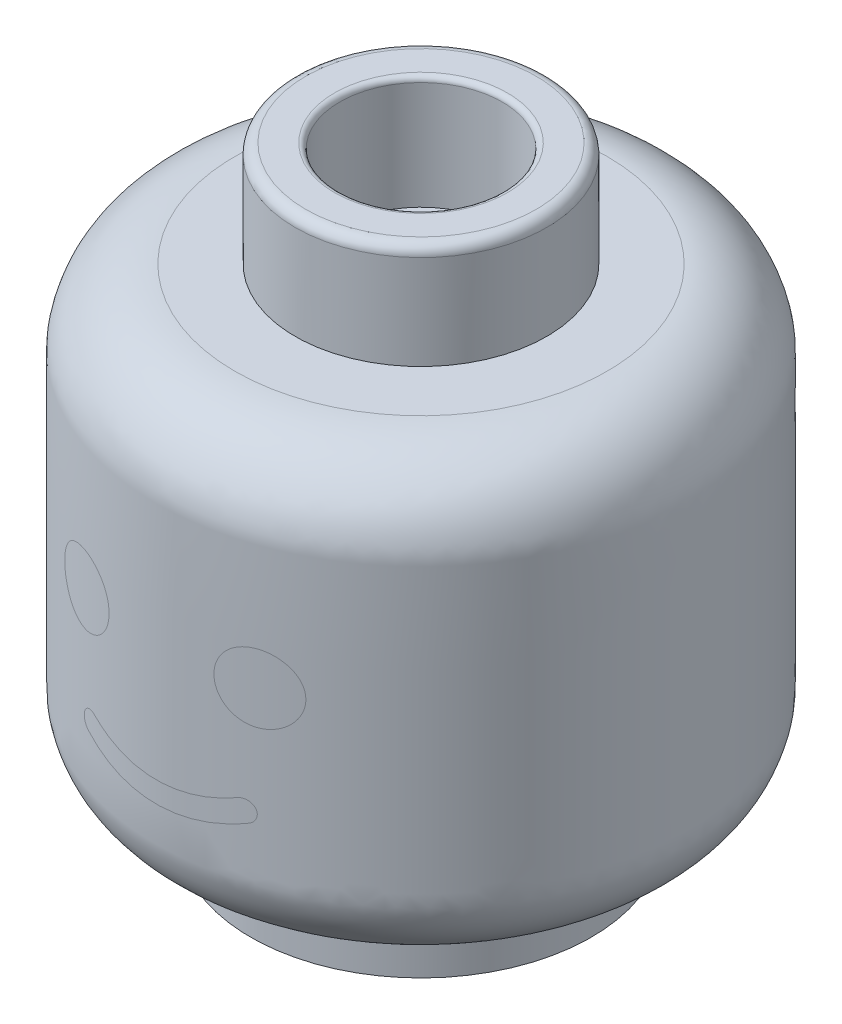
ISO-10303-21;
HEADER;
FILE_DESCRIPTION(('STEP AP214'),'2;1');
FILE_NAME('part.step','',(''),(''),'','','');
FILE_SCHEMA(('AUTOMOTIVE_DESIGN { 1 0 10303 214 1 1 1 1 }'));
ENDSEC;
DATA;
#1=APPLICATION_CONTEXT('core data for automotive mechanical design processes');
#2=APPLICATION_PROTOCOL_DEFINITION('international standard','automotive_design',2000,#1);
#3=PRODUCT_CONTEXT('',#1,'mechanical');
#4=PRODUCT('Part','Part','',(#3));
#5=PRODUCT_RELATED_PRODUCT_CATEGORY('part','',(#4));
#6=PRODUCT_DEFINITION_FORMATION('','',#4);
#7=PRODUCT_DEFINITION_CONTEXT('part definition',#1,'design');
#8=PRODUCT_DEFINITION('design','',#6,#7);
#9=PRODUCT_DEFINITION_SHAPE('','',#8);
#10=(LENGTH_UNIT() NAMED_UNIT(*) SI_UNIT(.MILLI.,.METRE.));
#11=(NAMED_UNIT(*) PLANE_ANGLE_UNIT() SI_UNIT($,.RADIAN.));
#12=(NAMED_UNIT(*) SI_UNIT($,.STERADIAN.) SOLID_ANGLE_UNIT());
#13=UNCERTAINTY_MEASURE_WITH_UNIT(LENGTH_MEASURE(1.E-05),#10,'distance_accuracy_value','');
#14=(GEOMETRIC_REPRESENTATION_CONTEXT(3) GLOBAL_UNCERTAINTY_ASSIGNED_CONTEXT((#13)) GLOBAL_UNIT_ASSIGNED_CONTEXT((#10,
#11,#12)) REPRESENTATION_CONTEXT('',''));
#15=CARTESIAN_POINT('',(0.,0.,0.));
#16=DIRECTION('',(0.,0.,1.));
#17=DIRECTION('',(1.,0.,0.));
#18=AXIS2_PLACEMENT_3D('',#15,#16,#17);
#19=CARTESIAN_POINT('',(3.55,1.1,0.));
#20=CARTESIAN_POINT('',(4.17589137733926,1.1,0.));
#21=CARTESIAN_POINT('',(4.69630103819903,1.44772661835333,0.));
#22=CARTESIAN_POINT('',(4.93581929876693,2.02597485145237,0.));
#23=CARTESIAN_POINT('',(4.96070524345038,2.08605483661961,0.));
#24=CARTESIAN_POINT('',(5.00266311704861,2.20945147826208,0.));
#25=CARTESIAN_POINT('',(5.05,2.40490967798387,0.));
#26=CARTESIAN_POINT('',(5.05,2.53496989266129,0.));
#27=CARTESIAN_POINT('',(5.05,2.6,0.));
#28=CARTESIAN_POINT('',(5.05,2.66503010733871,0.));
#29=CARTESIAN_POINT('',(5.05,2.79509032201613,0.));
#30=CARTESIAN_POINT('',(5.05,2.99018064403226,0.));
#31=CARTESIAN_POINT('',(5.05,3.12024085870968,0.));
#32=CARTESIAN_POINT('',(5.05,3.18527096604839,0.));
#33=CARTESIAN_POINT('',(5.05,4.59509032201613,0.));
#34=CARTESIAN_POINT('',(5.05,6.00490967798387,0.));
#35=CARTESIAN_POINT('',(5.05,7.41472903395162,0.));
#36=CARTESIAN_POINT('',(5.05,7.47975914129032,0.));
#37=CARTESIAN_POINT('',(5.05,7.60981935596774,0.));
#38=CARTESIAN_POINT('',(5.05,7.80490967798387,0.));
#39=CARTESIAN_POINT('',(5.05,7.93496989266129,0.));
#40=CARTESIAN_POINT('',(5.05,8.,0.));
#41=CARTESIAN_POINT('',(5.05,8.06503010733871,0.));
#42=CARTESIAN_POINT('',(5.05,8.19509032201613,0.));
#43=CARTESIAN_POINT('',(5.00266311704861,8.39054852173792,0.));
#44=CARTESIAN_POINT('',(4.96070524345038,8.51394516338039,0.));
#45=CARTESIAN_POINT('',(4.93581929876693,8.57402514854764,0.));
#46=CARTESIAN_POINT('',(4.69630103819903,9.15227338164667,0.));
#47=CARTESIAN_POINT('',(4.17589137733925,9.5,0.));
#48=CARTESIAN_POINT('',(3.55,9.5,0.));
#49=(BOUNDED_CURVE() B_SPLINE_CURVE(3,(#19,#20,#21,#22,#23,#24,#25,#26,#27,#28,#29,#30,#31,#32,
#33,#34,#35,#36,#37,#38,#39,#40,#41,#42,#43,#44,#45,#46,#47,#48),.UNSPECIFIED.,.F.,
.F.) B_SPLINE_CURVE_WITH_KNOTS((4,3,1,1,3,1,1,3,3,1,1,3,1,1,3,4),(0.,0.168287244559369,
0.187985451783234,0.2076836590071,0.227381866230966,0.247080073454831,0.266778280678697,
0.286476487902563,0.71352351209744,0.733221719321306,0.752919926545171,0.772618133769037,
0.792316340992902,0.812014548216767,0.831712755440633,1.),
.UNSPECIFIED.) CURVE() GEOMETRIC_REPRESENTATION_ITEM() RATIONAL_B_SPLINE_CURVE((1.,
0.887646408201697,0.887646408201697,1.,1.,1.,1.,1.,1.,1.,1.,1.,1.,1.,1.,1.,1.,1.,1.,1.,1.,1.,1.,
1.,1.,1.,1.,0.887646408201697,0.887646408201697,1.)) REPRESENTATION_ITEM(''));
#50=CARTESIAN_POINT('',(0.,0.,0.));
#51=DIRECTION('',(0.,-1.,0.));
#52=AXIS1_PLACEMENT('',#50,#51);
#53=SURFACE_OF_REVOLUTION('',#49,#52);
#54=CARTESIAN_POINT('',(1.36714285714286,3.79651528917438,4.86142164476229));
#55=CARTESIAN_POINT('',(1.29266723522622,3.76260469455131,4.88237816551986));
#56=CARTESIAN_POINT('',(1.21657172823008,3.73132179839762,4.90191913042248));
#57=CARTESIAN_POINT('',(1.06154680913207,3.67431173562556,4.9378052507651));
#58=CARTESIAN_POINT('',(0.982615742304379,3.64858787655107,4.95414850306991));
#59=CARTESIAN_POINT('',(0.822572068128998,3.60308187171532,4.98322021145015));
#60=CARTESIAN_POINT('',(0.741464041367122,3.5832881753945,4.99595569194396));
#61=CARTESIAN_POINT('',(0.577499633384524,3.54984745105246,5.01755192659933));
#62=CARTESIAN_POINT('',(0.494643675210375,3.53619895319578,5.02641360729852));
#63=CARTESIAN_POINT('',(0.328716514616189,3.51536009755695,5.03996999623906));
#64=CARTESIAN_POINT('',(0.245657739437477,3.5081002490967,5.04470953509775));
#65=CARTESIAN_POINT('',(0.079097298033524,3.49989442887723,5.05006803380517));
#66=CARTESIAN_POINT('',(-0.00440436234546057,3.49894837398007,5.0506870479116));
#67=CARTESIAN_POINT('',(-0.171153394940244,3.50338692737752,5.04778706830977));
#68=CARTESIAN_POINT('',(-0.2544008187996,3.50877015048636,5.04426898002155));
#69=CARTESIAN_POINT('',(-0.41994836527731,3.52577075096816,5.03319365567302));
#70=CARTESIAN_POINT('',(-0.502248631980166,3.53738716697367,5.02563704248945));
#71=CARTESIAN_POINT('',(-0.720314289136785,3.57659577110202,5.00024681425405));
#72=CARTESIAN_POINT('',(-0.854753796947773,3.60967842677157,4.97891932997482));
#73=CARTESIAN_POINT('',(-1.05112395767995,3.67112276295354,4.93985122210329));
#74=CARTESIAN_POINT('',(-1.115721768443,3.69358462416117,4.92564256085383));
#75=CARTESIAN_POINT('',(-1.24294828220809,3.74227102340385,4.89508427561815));
#76=CARTESIAN_POINT('',(-1.30557741936374,3.76849472463788,4.87873512784206));
#77=CARTESIAN_POINT('',(-1.36714285714286,3.79651528917438,4.86142164476229));
#78=B_SPLINE_CURVE_WITH_KNOTS('',3,(#54,#55,#56,#57,#58,#59,#60,#61,#62,#63,#64,#65,#66,#67,#68,
#69,#70,#71,#72,#73,#74,#75,#76,#77),.UNSPECIFIED.,.F.,.F.,(4,2,2,2,2,2,2,2,2,2,2,4),(0.,
0.253385360759964,0.50692106945284,0.759959690924754,1.01293775731806,1.2631288495795,
1.5133166474005,1.76344970089248,2.01354418656062,2.4320906298159,2.64151676014865,
2.85089637679997),.UNSPECIFIED.);
#79=CARTESIAN_POINT('',(1.36714285714286,3.79651528917438,4.86142164476229));
#80=VERTEX_POINT('',#79);
#81=CARTESIAN_POINT('',(-1.36714285714286,3.79651528917438,4.86142164476229));
#82=VERTEX_POINT('',#81);
#83=EDGE_CURVE('E67',#80,#82,#78,.T.);
#84=ORIENTED_EDGE('',*,*,#83,.T.);
#85=CARTESIAN_POINT('',(-1.36714285714286,3.79651528917438,4.86142164476229));
#86=CARTESIAN_POINT('',(-1.37782254753977,3.80138426985409,4.85841989808137));
#87=CARTESIAN_POINT('',(-1.3888918546896,3.80528034529479,4.85526742771636));
#88=CARTESIAN_POINT('',(-1.41146581976199,3.81108199269104,4.84875219853833));
#89=CARTESIAN_POINT('',(-1.42296989746332,3.81299012675909,4.84538971633678));
#90=CARTESIAN_POINT('',(-1.44609645199573,3.81478379162687,4.83853811704512));
#91=CARTESIAN_POINT('',(-1.45771890449905,3.81466972995684,4.83504902561184));
#92=CARTESIAN_POINT('',(-1.48075114210506,3.81244786748316,4.82804539520244));
#93=CARTESIAN_POINT('',(-1.49216090039083,3.81033981698397,4.82453085309398));
#94=CARTESIAN_POINT('',(-1.52591332359577,3.80098623975745,4.81400431957229));
#95=CARTESIAN_POINT('',(-1.54752921775068,3.79069318715248,4.80708372747643));
#96=CARTESIAN_POINT('',(-1.58583201815983,3.76315178893609,4.79458525200187));
#97=CARTESIAN_POINT('',(-1.60257287225737,3.74598499039121,4.78899280982525));
#98=CARTESIAN_POINT('',(-1.62862277624455,3.70728727287241,4.78019600560813));
#99=CARTESIAN_POINT('',(-1.63821602461845,3.6859714670605,4.77690070195441));
#100=CARTESIAN_POINT('',(-1.6492692282964,3.64228102107221,4.77309617739716));
#101=CARTESIAN_POINT('',(-1.65112866740857,3.62002022567189,4.77245013713828));
#102=CARTESIAN_POINT('',(-1.6475828331477,3.57686440183468,4.773674867138));
#103=CARTESIAN_POINT('',(-1.64239970877616,3.55594842539025,4.77546867713486));
#104=CARTESIAN_POINT('',(-1.62586234467635,3.5168724251166,4.7811239749597));
#105=CARTESIAN_POINT('',(-1.61445531133122,3.49873770341149,4.78500314743434));
#106=CARTESIAN_POINT('',(-1.58624361078964,3.466452504106,4.79442930189295));
#107=CARTESIAN_POINT('',(-1.56923584735401,3.45249705396779,4.80003843609608));
#108=CARTESIAN_POINT('',(-1.54486407600445,3.43828336911264,4.80790343737914));
#109=CARTESIAN_POINT('',(-1.53892124243785,3.43520940286127,4.80980953979115));
#110=CARTESIAN_POINT('',(-1.53285714285714,3.43245653634703,4.8117407431814));
#111=B_SPLINE_CURVE_WITH_KNOTS('',3,(#85,#86,#87,#88,#89,#90,#91,#92,#93,#94,#95,#96,#97,#98,
#99,#100,#101,#102,#103,#104,#105,#106,#107,#108,#109,#110),.UNSPECIFIED.,.F.,.F.,(4,2,2,2,2,2,
2,2,2,2,2,2,4),(0.,0.0362852054674041,0.0725235875106828,0.108754666567324,0.144990283230592,
0.218208595165982,0.290582861103124,0.359898253071838,0.425585018993091,0.489247164517709,
0.55345790744239,0.620315234666451,0.641147739583749),.UNSPECIFIED.);
#112=CARTESIAN_POINT('',(-1.53285714285714,3.43245653634703,4.8117407431814));
#113=VERTEX_POINT('',#112);
#114=EDGE_CURVE('E56',#82,#113,#111,.T.);
#115=ORIENTED_EDGE('',*,*,#114,.T.);
#116=CARTESIAN_POINT('',(-1.53285714285714,3.43245653634703,4.8117407431814));
#117=CARTESIAN_POINT('',(-1.4648159695563,3.40148903068884,4.83341549337015));
#118=CARTESIAN_POINT('',(-1.39554522360617,3.37244616688198,4.85389174121534));
#119=CARTESIAN_POINT('',(-1.25470367204976,3.31841634705009,4.89219366780111));
#120=CARTESIAN_POINT('',(-1.18313217656731,3.29343062140083,4.91001854234388));
#121=CARTESIAN_POINT('',(-0.965006670820809,3.2248134380607,4.95917578276361));
#122=CARTESIAN_POINT('',(-0.81528817050803,3.18763517312973,4.98611074966357));
#123=CARTESIAN_POINT('',(-0.572862524708573,3.14346136785837,5.01823249309913));
#124=CARTESIAN_POINT('',(-0.481773567494003,3.13034003106004,5.02780897246831));
#125=CARTESIAN_POINT('',(-0.298447361796857,3.11090631787235,5.04201005749673));
#126=CARTESIAN_POINT('',(-0.20620993725745,3.10459499876922,5.04663389423485));
#127=CARTESIAN_POINT('',(-0.0215104348650596,3.09890965334861,5.05079862248598));
#128=CARTESIAN_POINT('',(0.0709513019964215,3.09952829343329,5.05034488731692));
#129=CARTESIAN_POINT('',(0.255397966734603,3.10767141469995,5.04438126823079));
#130=CARTESIAN_POINT('',(0.347382947959673,3.11519510567131,5.0388719628707));
#131=CARTESIAN_POINT('',(0.522371447656534,3.1360915850716,5.02361216142381));
#132=CARTESIAN_POINT('',(0.605476392607721,3.14891563312945,5.01425994352114));
#133=CARTESIAN_POINT('',(0.770137209848639,3.18006743542455,4.99162268707305));
#134=CARTESIAN_POINT('',(0.851692440848545,3.19839741752489,4.97833605657933));
#135=CARTESIAN_POINT('',(1.01263103288475,3.24029697582685,4.94810832144928));
#136=CARTESIAN_POINT('',(1.09201703809278,3.26385982124508,4.93117191217198));
#137=CARTESIAN_POINT('',(1.24833139540884,3.31597143366031,4.89393720729385));
#138=CARTESIAN_POINT('',(1.32525952348435,3.34452065363434,4.87363860627022));
#139=CARTESIAN_POINT('',(1.44530794626767,3.3936230939826,4.83898133543619));
#140=CARTESIAN_POINT('',(1.48934391484856,3.41264822345395,4.82560457710464));
#141=CARTESIAN_POINT('',(1.53285714285714,3.43245653634703,4.8117407431814));
#142=B_SPLINE_CURVE_WITH_KNOTS('',3,(#116,#117,#118,#119,#120,#121,#122,#123,#124,#125,#126,
#127,#128,#129,#130,#131,#132,#133,#134,#135,#136,#137,#138,#139,#140,#141),.UNSPECIFIED.,.F.,
.F.,(4,2,2,2,2,2,2,2,2,2,2,2,4),(0.,0.233406744099065,0.466884139925314,0.93468021163061,
1.21193128677686,1.48922540022347,1.76622609617972,2.04319509626428,2.29673024529398,
2.550368120622,2.80368162392891,3.05701815096452,3.20636639006055),.UNSPECIFIED.);
#143=CARTESIAN_POINT('',(1.53285714285714,3.43245653634703,4.81174074318139));
#144=VERTEX_POINT('',#143);
#145=EDGE_CURVE('E60',#113,#144,#142,.T.);
#146=ORIENTED_EDGE('',*,*,#145,.T.);
#147=CARTESIAN_POINT('',(1.53285714285714,3.43245653634703,4.81174074318139));
#148=CARTESIAN_POINT('',(1.54314990738861,3.4371330339699,4.80846275410072));
#149=CARTESIAN_POINT('',(1.55306549133204,3.44270812112522,4.80526665470996));
#150=CARTESIAN_POINT('',(1.57188300526966,3.45550976011062,4.79914362872361));
#151=CARTESIAN_POINT('',(1.58078331592698,3.4627388964079,4.79621713353182));
#152=CARTESIAN_POINT('',(1.59728959874315,3.4786995311469,4.79074550077965));
#153=CARTESIAN_POINT('',(1.60489355249294,3.48743333058288,4.78820095863772));
#154=CARTESIAN_POINT('',(1.61852267597243,3.50616232046989,4.78361119056459));
#155=CARTESIAN_POINT('',(1.6245493714318,3.51615627795764,4.78156548222814));
#156=CARTESIAN_POINT('',(1.63460632354402,3.5367264114171,4.77813661472255));
#157=CARTESIAN_POINT('',(1.6387038471287,3.54726594033257,4.77673119814324));
#158=CARTESIAN_POINT('',(1.64507743379237,3.56895869651165,4.77453994767931));
#159=CARTESIAN_POINT('',(1.64735149705235,3.58011258326902,4.77375479406123));
#160=CARTESIAN_POINT('',(1.64990952825329,3.60212597510154,4.77287129699892));
#161=CARTESIAN_POINT('',(1.65028445018563,3.61297361711743,4.7727415648404));
#162=CARTESIAN_POINT('',(1.64928361055641,3.63458225371334,4.7730873993172));
#163=CARTESIAN_POINT('',(1.64790566183134,3.64534312315,4.77356372216444));
#164=CARTESIAN_POINT('',(1.64126359815222,3.67664022918674,4.77585377427546));
#165=CARTESIAN_POINT('',(1.63353919585106,3.69664811347538,4.77851225911387));
#166=CARTESIAN_POINT('',(1.61224585260368,3.73340355714173,4.78573780005945));
#167=CARTESIAN_POINT('',(1.5985437381359,3.75006337850981,4.79034826959527));
#168=CARTESIAN_POINT('',(1.56615310393842,3.77880287302926,4.80103820040773));
#169=CARTESIAN_POINT('',(1.54725611341829,3.79062314685951,4.80717774449897));
#170=CARTESIAN_POINT('',(1.50582080630999,3.80790019031169,4.82032045199287));
#171=CARTESIAN_POINT('',(1.48315238186919,3.81302891004136,4.82735075169213));
#172=CARTESIAN_POINT('',(1.44859726153904,3.81483075812967,4.83779107052643));
#173=CARTESIAN_POINT('',(1.4368204820676,3.81440057586486,4.84130126080971));
#174=CARTESIAN_POINT('',(1.41348391275889,3.8114721825522,4.8481654358768));
#175=CARTESIAN_POINT('',(1.4019238090225,3.80897724530268,4.85151965906981));
#176=CARTESIAN_POINT('',(1.38264780126677,3.80299242913752,4.85704203203006));
#177=CARTESIAN_POINT('',(1.37479110039574,3.8000024550923,4.85927157064902));
#178=CARTESIAN_POINT('',(1.36714285714285,3.79651528917438,4.86142164476229));
#179=B_SPLINE_CURVE_WITH_KNOTS('',3,(#147,#148,#149,#150,#151,#152,#153,#154,#155,#156,#157,
#158,#159,#160,#161,#162,#163,#164,#165,#166,#167,#168,#169,#170,#171,#172,#173,#174,#175,#176,
#177,#178),.UNSPECIFIED.,.F.,.F.,(4,2,2,2,2,2,2,2,2,2,2,2,2,2,2,4),(0.,0.0352810395189674,
0.0706175870795407,0.106008660388429,0.141365371234744,0.175376117721512,0.20942411353294,
0.241824946022435,0.27426624668853,0.337837742236629,0.402904242631317,0.471106226926806,
0.542539731976046,0.579284220999762,0.615970560707057,0.64199462781036),.UNSPECIFIED.);
#180=EDGE_CURVE('E65',#144,#80,#179,.T.);
#181=ORIENTED_EDGE('',*,*,#180,.T.);
#182=EDGE_LOOP('',(#84,#115,#146,#181));
#183=FACE_BOUND('',#182,.T.);
#184=ADVANCED_FACE('F41',(#183),#53,.F.);
#185=CARTESIAN_POINT('',(-0.999999999999999,5.7,4.95));
#186=CARTESIAN_POINT('',(-1.00000156871489,5.73587598153285,4.95000002039381));
#187=CARTESIAN_POINT('',(-1.0029807842663,5.77177529559928,4.94940071076765));
#188=CARTESIAN_POINT('',(-1.01481294772735,5.84257742902466,4.94698794692945));
#189=CARTESIAN_POINT('',(-1.02367220855787,5.8774791352811,4.94517318777015));
#190=CARTESIAN_POINT('',(-1.04697631120424,5.94524410712825,4.94029163230529));
#191=CARTESIAN_POINT('',(-1.06141681407669,5.97810893324764,4.93722580849356));
#192=CARTESIAN_POINT('',(-1.09542279603396,6.04090990575786,4.9297921257788));
#193=CARTESIAN_POINT('',(-1.1149887277708,6.07084579315874,4.92542415187174));
#194=CARTESIAN_POINT('',(-1.15871559314117,6.12709982074478,4.91532117846385));
#195=CARTESIAN_POINT('',(-1.18289635902429,6.15340146939299,4.90958025070582));
#196=CARTESIAN_POINT('',(-1.23502704130428,6.20155448371287,4.89672621155081));
#197=CARTESIAN_POINT('',(-1.26297725922841,6.22340549301615,4.88961299036125));
#198=CARTESIAN_POINT('',(-1.32229897979475,6.26249059974228,4.87390824921544));
#199=CARTESIAN_POINT('',(-1.35372182531466,6.27963714290742,4.86529302228246));
#200=CARTESIAN_POINT('',(-1.41862209249698,6.3084617835973,4.8467669652598));
#201=CARTESIAN_POINT('',(-1.45209981828326,6.32013906944982,4.83685594314495));
#202=CARTESIAN_POINT('',(-1.52134920836364,6.33817963053365,4.81553248322668));
#203=CARTESIAN_POINT('',(-1.55716016058934,6.34434414558962,4.80407983977103));
#204=CARTESIAN_POINT('',(-1.62903514393142,6.35066492671152,4.78018640698009));
#205=CARTESIAN_POINT('',(-1.66509949118793,6.35081143731443,4.76774404597061));
#206=CARTESIAN_POINT('',(-1.73827755063069,6.34507291336535,4.7415686566186));
#207=CARTESIAN_POINT('',(-1.77535617314283,6.33889218079066,4.72780226205189));
#208=CARTESIAN_POINT('',(-1.84779941987203,6.32030218993609,4.69996224233966));
#209=CARTESIAN_POINT('',(-1.88316364313709,6.30789148226479,4.68588854643019));
#210=CARTESIAN_POINT('',(-1.95263637801512,6.27655794236565,4.65737856052179));
#211=CARTESIAN_POINT('',(-1.98664236288414,6.25740033873785,4.64294949243363));
#212=CARTESIAN_POINT('',(-2.05093528837304,6.21310384566739,4.61491023392731));
#213=CARTESIAN_POINT('',(-2.08122004282812,6.18796146549443,4.60130052724293));
#214=CARTESIAN_POINT('',(-2.13673684021686,6.13255762656553,4.57578178899054));
#215=CARTESIAN_POINT('',(-2.16202600907364,6.10236235003684,4.56385403789255));
#216=CARTESIAN_POINT('',(-2.20696830070351,6.03740192824451,4.54229161921339));
#217=CARTESIAN_POINT('',(-2.22663583298121,6.00264880585833,4.53265109994034));
#218=CARTESIAN_POINT('',(-2.25807777289683,5.93257519260253,4.51706413586418));
#219=CARTESIAN_POINT('',(-2.27037289215558,5.89754267838272,4.51087701155061));
#220=CARTESIAN_POINT('',(-2.28884519894176,5.82552047970844,4.50153278895923));
#221=CARTESIAN_POINT('',(-2.29502752028948,5.78853246513104,4.49837314812498));
#222=CARTESIAN_POINT('',(-2.3006335364795,5.71765643112285,4.49550809552581));
#223=CARTESIAN_POINT('',(-2.30067120196088,5.68382823878782,4.49548889242399));
#224=CARTESIAN_POINT('',(-2.29551629158586,5.61668315982399,4.49812331474824));
#225=CARTESIAN_POINT('',(-2.29032458531124,5.58336618912033,4.50077649578889));
#226=CARTESIAN_POINT('',(-2.27519367560577,5.51920399826937,4.50844340244181));
#227=CARTESIAN_POINT('',(-2.26540279750127,5.48831449813182,4.51338331228193));
#228=CARTESIAN_POINT('',(-2.24151454487034,5.42862180745015,4.52529447131345));
#229=CARTESIAN_POINT('',(-2.22741041503585,5.3998219778672,4.53226890613164));
#230=CARTESIAN_POINT('',(-2.19445433550203,5.34335015272122,4.54832099998318));
#231=CARTESIAN_POINT('',(-2.17537556059497,5.31583887769029,4.55749672553447));
#232=CARTESIAN_POINT('',(-2.1335009626757,5.26430249489674,4.57724919917352));
#233=CARTESIAN_POINT('',(-2.11069769743142,5.24028455295696,4.58782874424931));
#234=CARTESIAN_POINT('',(-2.05957964339815,5.19398892543876,4.61101865508994));
#235=CARTESIAN_POINT('',(-2.03094336779527,5.17211470118091,4.62372641915725));
#236=CARTESIAN_POINT('',(-1.97065610754092,5.13346390959166,4.64974119772025));
#237=CARTESIAN_POINT('',(-1.9390037651401,5.11668965249911,4.66304848066798));
#238=CARTESIAN_POINT('',(-1.87091427592322,5.08748809275555,4.69080267384091));
#239=CARTESIAN_POINT('',(-1.83429631416801,5.07548937875424,4.70525916190082));
#240=CARTESIAN_POINT('',(-1.75942976734352,5.05812798079274,4.73376265473307));
#241=CARTESIAN_POINT('',(-1.72118361265209,5.05275574168868,4.74781022052939));
#242=CARTESIAN_POINT('',(-1.64355261657527,5.0488570121045,4.77524340428123));
#243=CARTESIAN_POINT('',(-1.60415949775502,5.0504177086673,4.7886184401913));
#244=CARTESIAN_POINT('',(-1.52591192559743,5.06073618746426,4.81412350599797));
#245=CARTESIAN_POINT('',(-1.48705735107105,5.06949232286026,4.82625382006266));
#246=CARTESIAN_POINT('',(-1.41272755994075,5.09364453051434,4.84852007071113));
#247=CARTESIAN_POINT('',(-1.37717927822516,5.10875936927461,4.85871660008424));
#248=CARTESIAN_POINT('',(-1.30901163697449,5.14527448446095,4.87752386368324));
#249=CARTESIAN_POINT('',(-1.27639128604806,5.16667262281228,4.88613513571986));
#250=CARTESIAN_POINT('',(-1.21681738927902,5.21396897334727,4.90130133803013));
#251=CARTESIAN_POINT('',(-1.1896609831131,5.23958570709039,4.90793809101787));
#252=CARTESIAN_POINT('',(-1.14000419911495,5.29528404715651,4.91970965184532));
#253=CARTESIAN_POINT('',(-1.11750243245906,5.32536431706248,4.92484490788239));
#254=CARTESIAN_POINT('',(-1.07858768403784,5.38806130038131,4.93351137159481));
#255=CARTESIAN_POINT('',(-1.06200041043119,5.4205636382524,4.93708933445774));
#256=CARTESIAN_POINT('',(-1.03448275498137,5.48796181023439,4.94292880036004));
#257=CARTESIAN_POINT('',(-1.0235456150609,5.52285472812151,4.94519187653039));
#258=CARTESIAN_POINT('',(-1.01042603993758,5.58162723361557,4.94788494868588));
#259=CARTESIAN_POINT('',(-1.00652211531339,5.60512090272988,4.94867864986229));
#260=CARTESIAN_POINT('',(-1.00130858465664,5.65240629263381,4.9497361667739));
#261=CARTESIAN_POINT('',(-0.999998959233091,5.67619801119434,4.94999998646969));
#262=CARTESIAN_POINT('',(-0.999999999999999,5.7,4.95));
#263=B_SPLINE_CURVE_WITH_KNOTS('',3,(#185,#186,#187,#188,#189,#190,#191,#192,#193,#194,#195,
#196,#197,#198,#199,#200,#201,#202,#203,#204,#205,#206,#207,#208,#209,#210,#211,#212,#213,#214,
#215,#216,#217,#218,#219,#220,#221,#222,#223,#224,#225,#226,#227,#228,#229,#230,#231,#232,#233,
#234,#235,#236,#237,#238,#239,#240,#241,#242,#243,#244,#245,#246,#247,#248,#249,#250,#251,#252,
#253,#254,#255,#256,#257,#258,#259,#260,#261,#262),.UNSPECIFIED.,.T.,.F.,(4,2,2,2,2,2,2,2,2,2,2,
2,2,2,2,2,2,2,2,2,2,2,2,2,2,2,2,2,2,2,2,2,2,2,2,2,2,2,4),(0.,0.107540926563868,
0.215197498140688,0.322770543643035,0.430353092658602,0.538408835536584,0.646473227177803,
0.756430079483302,0.866403244911731,0.980197928535387,1.09417707132649,1.21373743179819,
1.3333256206521,1.45757074434355,1.58188851461705,1.7046898840176,1.82717360413173,
1.93946278059191,2.05165757091919,2.15263427997549,2.25359420058815,2.35150082557582,
2.4495615816808,2.55327518809078,2.65719862776206,2.77134274835107,2.88553849841575,
3.00843517066722,3.13115442228313,3.2554213025623,3.37965974948714,3.4989011418779,
3.61810200585729,3.73128941679796,3.84444300668293,3.95391485249388,4.06325545500986,
4.13460422244054,4.20595245657538),.UNSPECIFIED.);
#264=CARTESIAN_POINT('',(-0.999999999999999,5.7,4.95));
#265=VERTEX_POINT('',#264);
#266=EDGE_CURVE('E74',#265,#265,#263,.T.);
#267=ORIENTED_EDGE('',*,*,#266,.T.);
#268=EDGE_LOOP('',(#267));
#269=FACE_BOUND('',#268,.T.);
#270=ADVANCED_FACE('F119',(#269),#53,.F.);
#271=CARTESIAN_POINT('',(2.29999999999996,5.7,4.49583140253286));
#272=CARTESIAN_POINT('',(2.29999806520821,5.73381996815471,4.49583274332479));
#273=CARTESIAN_POINT('',(2.29734627980311,5.76766388146638,4.49719204091121));
#274=CARTESIAN_POINT('',(2.28686242455758,5.83434604486249,4.50253187435874));
#275=CARTESIAN_POINT('',(2.27902422240683,5.86718305625784,4.50651551316131));
#276=CARTESIAN_POINT('',(2.25856078424339,5.93079103479481,4.51680551204221));
#277=CARTESIAN_POINT('',(2.24595484735464,5.96156975023102,4.52310250507924));
#278=CARTESIAN_POINT('',(2.21644355574723,6.02052128105928,4.53763700685395));
#279=CARTESIAN_POINT('',(2.199530864949,6.04868953702549,4.54587782489959));
#280=CARTESIAN_POINT('',(2.14124542042397,6.13108503761883,4.5737807380774));
#281=CARTESIAN_POINT('',(2.09339449737699,6.17999643832266,4.59605403844933));
#282=CARTESIAN_POINT('',(1.98064794283675,6.264467226796,4.64581800163548));
#283=CARTESIAN_POINT('',(1.91452687760248,6.29820393209599,4.67360761373923));
#284=CARTESIAN_POINT('',(1.80775170740668,6.33176988568278,4.7155238950679));
#285=CARTESIAN_POINT('',(1.76967317763025,6.34007944000631,4.72995415645607));
#286=CARTESIAN_POINT('',(1.69242162799108,6.34977531760048,4.75813836066783));
#287=CARTESIAN_POINT('',(1.65325046454363,6.35117274070223,4.77189335267329));
#288=CARTESIAN_POINT('',(1.57516276719606,6.34685475090458,4.79823454667437));
#289=CARTESIAN_POINT('',(1.53624608286581,6.3411808520423,4.81082710851096));
#290=CARTESIAN_POINT('',(1.45967395801194,6.32275560979221,4.83461031598279));
#291=CARTESIAN_POINT('',(1.42201816171463,6.31000628096662,4.84580135955622));
#292=CARTESIAN_POINT('',(1.35102961819424,6.27840647966801,4.8660578314111));
#293=CARTESIAN_POINT('',(1.31757641618992,6.25987527528912,4.87519907794013));
#294=CARTESIAN_POINT('',(1.25418044407799,6.2170007297031,4.89189192456171));
#295=CARTESIAN_POINT('',(1.22423669191076,6.19265902028438,4.89944396983792));
#296=CARTESIAN_POINT('',(1.17025378317981,6.14010875281232,4.91261070239797));
#297=CARTESIAN_POINT('',(1.14600327022621,6.11213567988389,4.91829975753561));
#298=CARTESIAN_POINT('',(1.10250977344427,6.05230868099858,4.92823207311031));
#299=CARTESIAN_POINT('',(1.08326598755463,6.02045537784373,4.93247556515559));
#300=CARTESIAN_POINT('',(1.05089396607997,5.95471239667373,4.93947264292008));
#301=CARTESIAN_POINT('',(1.03761442141105,5.92090108319942,4.94226341673378));
#302=CARTESIAN_POINT('',(1.01685631742848,5.8514654830133,4.94657625145341));
#303=CARTESIAN_POINT('',(1.00937735776474,5.81584132160318,4.94809839991904));
#304=CARTESIAN_POINT('',(1.00051130461678,5.74419892748405,4.94989874908666));
#305=CARTESIAN_POINT('',(0.999060215797399,5.70818892546276,4.95019001808844));
#306=CARTESIAN_POINT('',(1.00211978994336,5.63643398073205,4.94957152371793));
#307=CARTESIAN_POINT('',(1.00663029492324,5.60068903102384,4.94866179217281));
#308=CARTESIAN_POINT('',(1.02145224714462,5.53056204035769,4.94562348803444));
#309=CARTESIAN_POINT('',(1.03175055794303,5.49617710112088,4.94349767535666));
#310=CARTESIAN_POINT('',(1.05781019501448,5.42965327815316,4.93798682140415));
#311=CARTESIAN_POINT('',(1.07357146098521,5.39751436963437,4.9346017940291));
#312=CARTESIAN_POINT('',(1.11011450356096,5.33627020892202,4.92650948220578));
#313=CARTESIAN_POINT('',(1.13091265550883,5.30717530412071,4.92179787664572));
#314=CARTESIAN_POINT('',(1.1768361062267,5.25292143944349,4.91101940288492));
#315=CARTESIAN_POINT('',(1.2019615090215,5.22776257421563,4.90495250210256));
#316=CARTESIAN_POINT('',(1.2560817688462,5.18172792737438,4.89137452997815));
#317=CARTESIAN_POINT('',(1.28512050352129,5.160908761536,4.88384657951112));
#318=CARTESIAN_POINT('',(1.34591968079521,5.12441964327914,4.86744192757089));
#319=CARTESIAN_POINT('',(1.37768041341755,5.10875024041986,4.85856508229752));
#320=CARTESIAN_POINT('',(1.44391779353369,5.08247653286426,4.83929985853069));
#321=CARTESIAN_POINT('',(1.47844591610852,5.0720284547097,4.82887575629873));
#322=CARTESIAN_POINT('',(1.54840435498328,5.05699191288997,4.80690015624268));
#323=CARTESIAN_POINT('',(1.58383486745369,5.05240473460807,4.79534841170747));
#324=CARTESIAN_POINT('',(1.6562695941092,5.04897481751671,4.77082772240613));
#325=CARTESIAN_POINT('',(1.69327277147251,5.05040027340308,4.75781837107634));
#326=CARTESIAN_POINT('',(1.76635940339589,5.05943788502498,4.73117236698339));
#327=CARTESIAN_POINT('',(1.8024408566269,5.06706248871822,4.71753450418718));
#328=CARTESIAN_POINT('',(1.87441684605351,5.0887585428827,4.6894161494531));
#329=CARTESIAN_POINT('',(1.91022080399838,5.10311947570099,4.6749264395734));
#330=CARTESIAN_POINT('',(1.97878441846184,5.13797032432686,4.64632017119797));
#331=CARTESIAN_POINT('',(2.01154933384354,5.15844938365386,4.6322029995368));
#332=CARTESIAN_POINT('',(2.07357506097357,5.20541360548688,4.60477479967716));
#333=CARTESIAN_POINT('',(2.10278805191279,5.23196924246363,4.59147575951146));
#334=CARTESIAN_POINT('',(2.15625139253687,5.29039567149785,4.56661263328881));
#335=CARTESIAN_POINT('',(2.18050210341497,5.32226607639858,4.555048420974));
#336=CARTESIAN_POINT('',(2.22175532164321,5.38850676179883,4.5350633080938));
#337=CARTESIAN_POINT('',(2.23910086055269,5.42261888796389,4.52649728652613));
#338=CARTESIAN_POINT('',(2.2676297727308,5.49385116649559,4.51227359123478));
#339=CARTESIAN_POINT('',(2.27882721290435,5.53096422739898,4.50660928037891));
#340=CARTESIAN_POINT('',(2.29106898042459,5.59039162369862,4.50039169436658));
#341=CARTESIAN_POINT('',(2.29441062014173,5.61213948267485,4.49868715169646));
#342=CARTESIAN_POINT('',(2.29887670263354,5.65592151331073,4.4964065982553));
#343=CARTESIAN_POINT('',(2.30000126112438,5.67795566996722,4.49583052858585));
#344=CARTESIAN_POINT('',(2.29999999999996,5.7,4.49583140253286));
#345=B_SPLINE_CURVE_WITH_KNOTS('',3,(#271,#272,#273,#274,#275,#276,#277,#278,#279,#280,#281,
#282,#283,#284,#285,#286,#287,#288,#289,#290,#291,#292,#293,#294,#295,#296,#297,#298,#299,#300,
#301,#302,#303,#304,#305,#306,#307,#308,#309,#310,#311,#312,#313,#314,#315,#316,#317,#318,#319,
#320,#321,#322,#323,#324,#325,#326,#327,#328,#329,#330,#331,#332,#333,#334,#335,#336,#337,#338,
#339,#340,#341,#342,#343,#344),.UNSPECIFIED.,.T.,.F.,(4,2,2,2,2,2,2,2,2,2,2,2,2,2,2,2,2,2,2,2,2,
2,2,2,2,2,2,2,2,2,2,2,2,2,2,2,4),(0.,0.101373277108019,0.202866630548822,0.303953475310362,
0.405213675814335,0.617569408669602,0.851145724390334,0.975331334980788,1.09931745748472,
1.22257910382316,1.34580567230043,1.46316721646772,1.58049584019819,1.69231054468864,
1.804107325785,1.91288079321471,2.0216467525494,2.12925499164395,2.23686037911901,
2.34422251786778,2.45158347154774,2.55929826431169,2.66701564684329,2.77606075587598,
2.88511749792918,2.99726667925103,3.1094404523512,3.22666943928676,3.34413440641077,
3.46718840564187,3.5900253322869,3.71436640531018,3.83869842460369,3.95570040089502,
4.07243354806602,4.13851352224211,4.20459004741359),.UNSPECIFIED.);
#346=CARTESIAN_POINT('',(2.29999999999996,5.7,4.49583140253286));
#347=VERTEX_POINT('',#346);
#348=EDGE_CURVE('E80',#347,#347,#345,.T.);
#349=ORIENTED_EDGE('',*,*,#348,.T.);
#350=EDGE_LOOP('',(#349));
#351=FACE_BOUND('',#350,.T.);
#352=ADVANCED_FACE('F120',(#351),#53,.F.);
#353=CARTESIAN_POINT('',(0.,8.5,0.));
#354=DIRECTION('',(0.,-1.,0.));
#355=DIRECTION('',(0.,0.,-1.));
#356=AXIS2_PLACEMENT_3D('',#353,#354,#355);
#357=PLANE('',#356);
#358=CARTESIAN_POINT('',(0.,8.5,0.));
#359=DIRECTION('',(0.,-1.,0.));
#360=DIRECTION('',(0.,0.,-1.));
#361=AXIS2_PLACEMENT_3D('',#358,#359,#360);
#362=CIRCLE('',#361,2.4);
#363=CARTESIAN_POINT('',(0.,8.5,-2.4));
#364=VERTEX_POINT('',#363);
#365=EDGE_CURVE('E168',#364,#364,#362,.T.);
#366=ORIENTED_EDGE('',*,*,#365,.T.);
#367=EDGE_LOOP('',(#366));
#368=FACE_BOUND('',#367,.T.);
#369=ADVANCED_FACE('F126',(#368),#357,.T.);
#370=CARTESIAN_POINT('',(0.,0.,0.));
#371=DIRECTION('',(0.,-1.,0.));
#372=DIRECTION('',(0.,0.,-1.));
#373=AXIS2_PLACEMENT_3D('',#370,#371,#372);
#374=CYLINDRICAL_SURFACE('',#373,2.4);
#375=CARTESIAN_POINT('',(0.,0.,0.));
#376=DIRECTION('',(0.,-1.,0.));
#377=DIRECTION('',(0.,0.,-1.));
#378=AXIS2_PLACEMENT_3D('',#375,#376,#377);
#379=CIRCLE('',#378,2.4);
#380=CARTESIAN_POINT('',(0.,0.,-2.4));
#381=VERTEX_POINT('',#380);
#382=EDGE_CURVE('E219',#381,#381,#379,.T.);
#383=ORIENTED_EDGE('',*,*,#382,.T.);
#384=EDGE_LOOP('',(#383));
#385=FACE_BOUND('',#384,.T.);
#386=ORIENTED_EDGE('',*,*,#365,.F.);
#387=EDGE_LOOP('',(#386));
#388=FACE_BOUND('',#387,.T.);
#389=ADVANCED_FACE('F153',(#385,#388),#374,.F.);
#390=CARTESIAN_POINT('',(3.25,0.,0.));
#391=DIRECTION('',(0.,-1.,0.));
#392=DIRECTION('',(0.,0.,-1.));
#393=AXIS2_PLACEMENT_3D('',#390,#391,#392);
#394=PLANE('',#393);
#395=CARTESIAN_POINT('',(0.,0.,0.));
#396=DIRECTION('',(0.,-1.,0.));
#397=DIRECTION('',(0.,0.,-1.));
#398=AXIS2_PLACEMENT_3D('',#395,#396,#397);
#399=CIRCLE('',#398,3.25);
#400=CARTESIAN_POINT('',(0.,0.,-3.25));
#401=VERTEX_POINT('',#400);
#402=EDGE_CURVE('E217',#401,#401,#399,.T.);
#403=ORIENTED_EDGE('',*,*,#402,.T.);
#404=EDGE_LOOP('',(#403));
#405=FACE_BOUND('',#404,.T.);
#406=ORIENTED_EDGE('',*,*,#382,.F.);
#407=EDGE_LOOP('',(#406));
#408=FACE_BOUND('',#407,.T.);
#409=ADVANCED_FACE('F144',(#405,#408),#394,.T.);
#410=CARTESIAN_POINT('',(0.,0.,0.));
#411=DIRECTION('',(0.,-1.,0.));
#412=DIRECTION('',(0.,0.,-1.));
#413=AXIS2_PLACEMENT_3D('',#410,#411,#412);
#414=CYLINDRICAL_SURFACE('',#413,3.25);
#415=CARTESIAN_POINT('',(0.,1.1,0.));
#416=DIRECTION('',(0.,-1.,0.));
#417=DIRECTION('',(0.,0.,-1.));
#418=AXIS2_PLACEMENT_3D('',#415,#416,#417);
#419=CIRCLE('',#418,3.25);
#420=CARTESIAN_POINT('',(0.,1.1,-3.25));
#421=VERTEX_POINT('',#420);
#422=EDGE_CURVE('E214',#421,#421,#419,.T.);
#423=ORIENTED_EDGE('',*,*,#422,.T.);
#424=EDGE_LOOP('',(#423));
#425=FACE_BOUND('',#424,.T.);
#426=ORIENTED_EDGE('',*,*,#402,.F.);
#427=EDGE_LOOP('',(#426));
#428=FACE_BOUND('',#427,.T.);
#429=ADVANCED_FACE('F138',(#425,#428),#414,.T.);
#430=CARTESIAN_POINT('',(3.55,1.1,0.));
#431=DIRECTION('',(0.,-1.,0.));
#432=DIRECTION('',(0.,0.,-1.));
#433=AXIS2_PLACEMENT_3D('',#430,#431,#432);
#434=PLANE('',#433);
#435=CARTESIAN_POINT('',(0.,1.1,0.));
#436=DIRECTION('',(0.,-1.,0.));
#437=DIRECTION('',(0.,0.,-1.));
#438=AXIS2_PLACEMENT_3D('',#435,#436,#437);
#439=CIRCLE('',#438,3.55);
#440=CARTESIAN_POINT('',(0.,1.1,-3.55));
#441=VERTEX_POINT('',#440);
#442=EDGE_CURVE('E212',#441,#441,#439,.T.);
#443=ORIENTED_EDGE('',*,*,#442,.T.);
#444=EDGE_LOOP('',(#443));
#445=FACE_BOUND('',#444,.T.);
#446=ORIENTED_EDGE('',*,*,#422,.F.);
#447=EDGE_LOOP('',(#446));
#448=FACE_BOUND('',#447,.T.);
#449=ADVANCED_FACE('F130',(#445,#448),#434,.T.);
#450=ORIENTED_EDGE('',*,*,#114,.F.);
#451=ORIENTED_EDGE('',*,*,#83,.F.);
#452=ORIENTED_EDGE('',*,*,#180,.F.);
#453=ORIENTED_EDGE('',*,*,#145,.F.);
#454=EDGE_LOOP('',(#450,#451,#452,#453));
#455=FACE_BOUND('',#454,.T.);
#456=ORIENTED_EDGE('',*,*,#266,.F.);
#457=EDGE_LOOP('',(#456));
#458=FACE_BOUND('',#457,.T.);
#459=ORIENTED_EDGE('',*,*,#348,.F.);
#460=EDGE_LOOP('',(#459));
#461=FACE_BOUND('',#460,.T.);
#462=CARTESIAN_POINT('',(0.,9.5,0.));
#463=DIRECTION('',(0.,-1.,0.));
#464=DIRECTION('',(0.,0.,-1.));
#465=AXIS2_PLACEMENT_3D('',#462,#463,#464);
#466=CIRCLE('',#465,3.55);
#467=CARTESIAN_POINT('',(0.,9.5,-3.55));
#468=VERTEX_POINT('',#467);
#469=EDGE_CURVE('E207',#468,#468,#466,.T.);
#470=ORIENTED_EDGE('',*,*,#469,.T.);
#471=EDGE_LOOP('',(#470));
#472=FACE_BOUND('',#471,.T.);
#473=ORIENTED_EDGE('',*,*,#442,.F.);
#474=EDGE_LOOP('',(#473));
#475=FACE_BOUND('',#474,.T.);
#476=ADVANCED_FACE('F71',(#455,#458,#461,#472,#475),#53,.F.);
#477=CARTESIAN_POINT('',(2.4,9.5,0.));
#478=DIRECTION('',(0.,1.,0.));
#479=DIRECTION('',(0.,0.,1.));
#480=AXIS2_PLACEMENT_3D('',#477,#478,#479);
#481=PLANE('',#480);
#482=CARTESIAN_POINT('',(0.,9.5,0.));
#483=DIRECTION('',(0.,-1.,0.));
#484=DIRECTION('',(0.,0.,-1.));
#485=AXIS2_PLACEMENT_3D('',#482,#483,#484);
#486=CIRCLE('',#485,2.4);
#487=CARTESIAN_POINT('',(0.,9.5,-2.4));
#488=VERTEX_POINT('',#487);
#489=EDGE_CURVE('E204',#488,#488,#486,.T.);
#490=ORIENTED_EDGE('',*,*,#489,.T.);
#491=EDGE_LOOP('',(#490));
#492=FACE_BOUND('',#491,.T.);
#493=ORIENTED_EDGE('',*,*,#469,.F.);
#494=EDGE_LOOP('',(#493));
#495=FACE_BOUND('',#494,.T.);
#496=ADVANCED_FACE('F129',(#492,#495),#481,.T.);
#497=CARTESIAN_POINT('',(0.,0.,0.));
#498=DIRECTION('',(0.,-1.,0.));
#499=DIRECTION('',(0.,0.,-1.));
#500=AXIS2_PLACEMENT_3D('',#497,#498,#499);
#501=CYLINDRICAL_SURFACE('',#500,2.4);
#502=CARTESIAN_POINT('',(0.,11.3,0.));
#503=DIRECTION('',(0.,1.,0.));
#504=DIRECTION('',(0.,0.,1.));
#505=AXIS2_PLACEMENT_3D('',#502,#503,#504);
#506=CIRCLE('',#505,2.4);
#507=CARTESIAN_POINT('',(0.,11.3,2.4));
#508=VERTEX_POINT('',#507);
#509=EDGE_CURVE('E184',#508,#508,#506,.F.);
#510=ORIENTED_EDGE('',*,*,#509,.T.);
#511=EDGE_LOOP('',(#510));
#512=FACE_BOUND('',#511,.T.);
#513=ORIENTED_EDGE('',*,*,#489,.F.);
#514=EDGE_LOOP('',(#513));
#515=FACE_BOUND('',#514,.T.);
#516=ADVANCED_FACE('F135',(#512,#515),#501,.T.);
#517=CARTESIAN_POINT('',(0.,11.5,0.));
#518=DIRECTION('',(0.,1.,0.));
#519=DIRECTION('',(0.,0.,1.));
#520=AXIS2_PLACEMENT_3D('',#517,#518,#519);
#521=PLANE('',#520);
#522=CARTESIAN_POINT('',(0.,11.5,0.));
#523=DIRECTION('',(0.,1.,0.));
#524=DIRECTION('',(0.,0.,1.));
#525=AXIS2_PLACEMENT_3D('',#522,#523,#524);
#526=CIRCLE('',#525,1.65);
#527=CARTESIAN_POINT('',(0.,11.5,1.65));
#528=VERTEX_POINT('',#527);
#529=EDGE_CURVE('E11',#528,#528,#526,.F.);
#530=ORIENTED_EDGE('',*,*,#529,.T.);
#531=EDGE_LOOP('',(#530));
#532=FACE_BOUND('',#531,.T.);
#533=CARTESIAN_POINT('',(0.,11.5,0.));
#534=DIRECTION('',(0.,1.,0.));
#535=DIRECTION('',(0.,0.,1.));
#536=AXIS2_PLACEMENT_3D('',#533,#534,#535);
#537=CIRCLE('',#536,2.2);
#538=CARTESIAN_POINT('',(0.,11.5,2.2));
#539=VERTEX_POINT('',#538);
#540=EDGE_CURVE('E191',#539,#539,#537,.T.);
#541=ORIENTED_EDGE('',*,*,#540,.T.);
#542=EDGE_LOOP('',(#541));
#543=FACE_BOUND('',#542,.T.);
#544=ADVANCED_FACE('F199',(#532,#543),#521,.T.);
#545=CARTESIAN_POINT('',(0.,9.34,0.));
#546=DIRECTION('',(0.,1.,0.));
#547=DIRECTION('',(0.,0.,1.));
#548=AXIS2_PLACEMENT_3D('',#545,#546,#547);
#549=CYLINDRICAL_SURFACE('',#548,1.55);
#550=CARTESIAN_POINT('',(0.,11.4,0.));
#551=DIRECTION('',(0.,1.,0.));
#552=DIRECTION('',(0.,0.,1.));
#553=AXIS2_PLACEMENT_3D('',#550,#551,#552);
#554=CIRCLE('',#553,1.55);
#555=CARTESIAN_POINT('',(0.,11.4,1.55));
#556=VERTEX_POINT('',#555);
#557=EDGE_CURVE('E49',#556,#556,#554,.T.);
#558=ORIENTED_EDGE('',*,*,#557,.T.);
#559=EDGE_LOOP('',(#558));
#560=FACE_BOUND('',#559,.T.);
#561=CARTESIAN_POINT('',(0.,9.34,0.));
#562=DIRECTION('',(0.,1.,0.));
#563=DIRECTION('',(0.,0.,1.));
#564=AXIS2_PLACEMENT_3D('',#561,#562,#563);
#565=CIRCLE('',#564,1.55);
#566=CARTESIAN_POINT('',(0.,9.34,1.55));
#567=VERTEX_POINT('',#566);
#568=EDGE_CURVE('E203',#567,#567,#565,.T.);
#569=ORIENTED_EDGE('',*,*,#568,.F.);
#570=EDGE_LOOP('',(#569));
#571=FACE_BOUND('',#570,.T.);
#572=ADVANCED_FACE('F113',(#560,#571),#549,.F.);
#573=CARTESIAN_POINT('',(0.,9.34,0.));
#574=DIRECTION('',(0.,1.,0.));
#575=DIRECTION('',(0.,0.,1.));
#576=AXIS2_PLACEMENT_3D('',#573,#574,#575);
#577=PLANE('',#576);
#578=ORIENTED_EDGE('',*,*,#568,.T.);
#579=EDGE_LOOP('',(#578));
#580=FACE_BOUND('',#579,.T.);
#581=ADVANCED_FACE('F106',(#580),#577,.T.);
#582=CARTESIAN_POINT('',(0.,11.3,0.));
#583=DIRECTION('',(0.,1.,0.));
#584=DIRECTION('',(0.,0.,1.));
#585=AXIS2_PLACEMENT_3D('',#582,#583,#584);
#586=TOROIDAL_SURFACE('',#585,2.2,0.2);
#587=ORIENTED_EDGE('',*,*,#540,.F.);
#588=EDGE_LOOP('',(#587));
#589=FACE_BOUND('',#588,.T.);
#590=ORIENTED_EDGE('',*,*,#509,.F.);
#591=EDGE_LOOP('',(#590));
#592=FACE_BOUND('',#591,.T.);
#593=ADVANCED_FACE('F104',(#589,#592),#586,.T.);
#594=CARTESIAN_POINT('',(0.,11.4,0.));
#595=DIRECTION('',(0.,1.,0.));
#596=DIRECTION('',(0.,0.,1.));
#597=AXIS2_PLACEMENT_3D('',#594,#595,#596);
#598=TOROIDAL_SURFACE('',#597,1.65,0.1);
#599=ORIENTED_EDGE('',*,*,#529,.F.);
#600=EDGE_LOOP('',(#599));
#601=FACE_BOUND('',#600,.T.);
#602=ORIENTED_EDGE('',*,*,#557,.F.);
#603=EDGE_LOOP('',(#602));
#604=FACE_BOUND('',#603,.T.);
#605=ADVANCED_FACE('F43',(#601,#604),#598,.T.);
#606=CLOSED_SHELL('',(#184,#270,#352,#369,#389,#409,#429,#449,#476,#496,#516,#544,#572,#581,
#593,#605));
#607=MANIFOLD_SOLID_BREP('B2',#606);
#608=ADVANCED_BREP_SHAPE_REPRESENTATION('',(#18,#607),#14);
#609=SHAPE_DEFINITION_REPRESENTATION(#9,#608);
ENDSEC;
END-ISO-10303-21;
